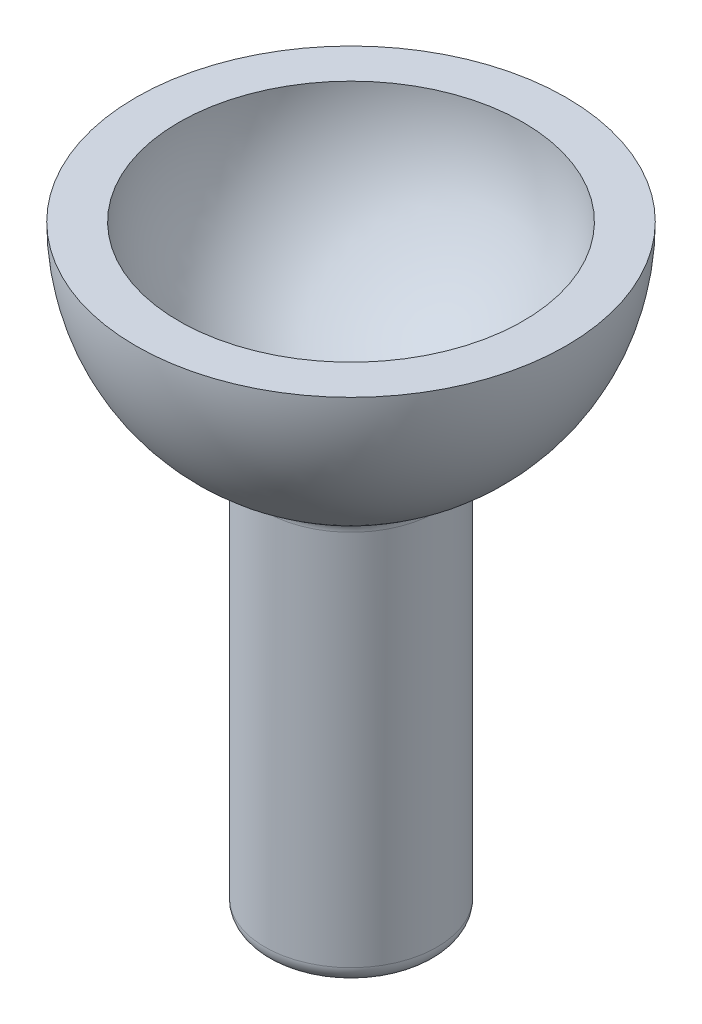
ISO-10303-21;
HEADER;
FILE_DESCRIPTION(('STEP AP214'),'2;1');
FILE_NAME('part.step','',(''),(''),'','','');
FILE_SCHEMA(('AUTOMOTIVE_DESIGN { 1 0 10303 214 1 1 1 1 }'));
ENDSEC;
DATA;
#1=APPLICATION_CONTEXT('core data for automotive mechanical design processes');
#2=APPLICATION_PROTOCOL_DEFINITION('international standard','automotive_design',2000,#1);
#3=PRODUCT_CONTEXT('',#1,'mechanical');
#4=PRODUCT('Part','Part','',(#3));
#5=PRODUCT_RELATED_PRODUCT_CATEGORY('part','',(#4));
#6=PRODUCT_DEFINITION_FORMATION('','',#4);
#7=PRODUCT_DEFINITION_CONTEXT('part definition',#1,'design');
#8=PRODUCT_DEFINITION('design','',#6,#7);
#9=PRODUCT_DEFINITION_SHAPE('','',#8);
#10=(LENGTH_UNIT() NAMED_UNIT(*) SI_UNIT(.MILLI.,.METRE.));
#11=(NAMED_UNIT(*) PLANE_ANGLE_UNIT() SI_UNIT($,.RADIAN.));
#12=(NAMED_UNIT(*) SI_UNIT($,.STERADIAN.) SOLID_ANGLE_UNIT());
#13=UNCERTAINTY_MEASURE_WITH_UNIT(LENGTH_MEASURE(1.E-05),#10,'distance_accuracy_value','');
#14=(GEOMETRIC_REPRESENTATION_CONTEXT(3) GLOBAL_UNCERTAINTY_ASSIGNED_CONTEXT((#13)) GLOBAL_UNIT_ASSIGNED_CONTEXT((#10,
#11,#12)) REPRESENTATION_CONTEXT('',''));
#15=CARTESIAN_POINT('',(0.,0.,0.));
#16=DIRECTION('',(0.,0.,1.));
#17=DIRECTION('',(1.,0.,0.));
#18=AXIS2_PLACEMENT_3D('',#15,#16,#17);
#19=CARTESIAN_POINT('',(0.,0.,0.));
#20=DIRECTION('',(0.,-1.,0.));
#21=DIRECTION('',(1.,0.,0.));
#22=AXIS2_PLACEMENT_3D('',#19,#20,#21);
#23=SPHERICAL_SURFACE('',#22,12.5);
#24=CARTESIAN_POINT('',(0.,-11.1975802059702,0.));
#25=DIRECTION('',(0.,1.,0.));
#26=DIRECTION('',(0.,0.,1.));
#27=AXIS2_PLACEMENT_3D('',#24,#25,#26);
#28=CIRCLE('',#27,5.55555555555555);
#29=CARTESIAN_POINT('',(0.,-11.1975802059702,5.55555555555555));
#30=VERTEX_POINT('',#29);
#31=EDGE_CURVE('E46',#30,#30,#28,.T.);
#32=ORIENTED_EDGE('',*,*,#31,.T.);
#33=EDGE_LOOP('',(#32));
#34=FACE_BOUND('',#33,.T.);
#35=CARTESIAN_POINT('',(0.,0.,0.));
#36=DIRECTION('',(0.,-1.,0.));
#37=DIRECTION('',(0.,0.,-1.));
#38=AXIS2_PLACEMENT_3D('',#35,#36,#37);
#39=CIRCLE('',#38,12.5);
#40=CARTESIAN_POINT('',(0.,0.,-12.5));
#41=VERTEX_POINT('',#40);
#42=EDGE_CURVE('E59',#41,#41,#39,.T.);
#43=ORIENTED_EDGE('',*,*,#42,.T.);
#44=EDGE_LOOP('',(#43));
#45=FACE_BOUND('',#44,.T.);
#46=ADVANCED_FACE('F39',(#34,#45),#23,.T.);
#47=CARTESIAN_POINT('',(0.,0.,0.));
#48=DIRECTION('',(0.,-1.,0.));
#49=DIRECTION('',(0.,0.,-1.));
#50=AXIS2_PLACEMENT_3D('',#47,#48,#49);
#51=PLANE('',#50);
#52=ORIENTED_EDGE('',*,*,#42,.F.);
#53=EDGE_LOOP('',(#52));
#54=FACE_BOUND('',#53,.T.);
#55=CARTESIAN_POINT('',(0.,0.,0.));
#56=DIRECTION('',(0.,-1.,0.));
#57=DIRECTION('',(0.,0.,-1.));
#58=AXIS2_PLACEMENT_3D('',#55,#56,#57);
#59=CIRCLE('',#58,10.);
#60=CARTESIAN_POINT('',(0.,0.,-10.));
#61=VERTEX_POINT('',#60);
#62=EDGE_CURVE('E62',#61,#61,#59,.T.);
#63=ORIENTED_EDGE('',*,*,#62,.T.);
#64=EDGE_LOOP('',(#63));
#65=FACE_BOUND('',#64,.T.);
#66=ADVANCED_FACE('F66',(#54,#65),#51,.F.);
#67=CARTESIAN_POINT('',(0.,0.,0.));
#68=DIRECTION('',(0.,-1.,0.));
#69=DIRECTION('',(-1.,0.,0.));
#70=AXIS2_PLACEMENT_3D('',#67,#68,#69);
#71=SPHERICAL_SURFACE('',#70,10.);
#72=ORIENTED_EDGE('',*,*,#62,.F.);
#73=EDGE_LOOP('',(#72));
#74=FACE_BOUND('',#73,.T.);
#75=ADVANCED_FACE('F68',(#74),#71,.F.);
#76=CARTESIAN_POINT('',(0.,-35.,0.));
#77=DIRECTION('',(0.,-1.,0.));
#78=DIRECTION('',(0.,0.,-1.));
#79=AXIS2_PLACEMENT_3D('',#76,#77,#78);
#80=PLANE('',#79);
#81=CARTESIAN_POINT('',(0.,-35.,0.));
#82=DIRECTION('',(0.,-1.,0.));
#83=DIRECTION('',(0.,0.,-1.));
#84=AXIS2_PLACEMENT_3D('',#81,#82,#83);
#85=CIRCLE('',#84,4.);
#86=CARTESIAN_POINT('',(0.,-35.,-4.));
#87=VERTEX_POINT('',#86);
#88=EDGE_CURVE('E10',#87,#87,#85,.T.);
#89=ORIENTED_EDGE('',*,*,#88,.T.);
#90=EDGE_LOOP('',(#89));
#91=FACE_BOUND('',#90,.T.);
#92=ADVANCED_FACE('F70',(#91),#80,.T.);
#93=CARTESIAN_POINT('',(0.,-11.8769057703332,0.));
#94=DIRECTION('',(0.,-1.,0.));
#95=DIRECTION('',(0.,0.,-1.));
#96=AXIS2_PLACEMENT_3D('',#93,#94,#95);
#97=CYLINDRICAL_SURFACE('',#96,5.);
#98=CARTESIAN_POINT('',(0.,-12.0933866224478,0.));
#99=DIRECTION('',(0.,1.,0.));
#100=DIRECTION('',(0.,0.,1.));
#101=AXIS2_PLACEMENT_3D('',#98,#99,#100);
#102=CIRCLE('',#101,5.);
#103=CARTESIAN_POINT('',(0.,-12.0933866224478,5.));
#104=VERTEX_POINT('',#103);
#105=EDGE_CURVE('E50',#104,#104,#102,.F.);
#106=ORIENTED_EDGE('',*,*,#105,.T.);
#107=EDGE_LOOP('',(#106));
#108=FACE_BOUND('',#107,.T.);
#109=CARTESIAN_POINT('',(0.,-34.,0.));
#110=DIRECTION('',(0.,-1.,0.));
#111=DIRECTION('',(0.,0.,-1.));
#112=AXIS2_PLACEMENT_3D('',#109,#110,#111);
#113=CIRCLE('',#112,5.);
#114=CARTESIAN_POINT('',(0.,-34.,-5.));
#115=VERTEX_POINT('',#114);
#116=EDGE_CURVE('E54',#115,#115,#113,.F.);
#117=ORIENTED_EDGE('',*,*,#116,.T.);
#118=EDGE_LOOP('',(#117));
#119=FACE_BOUND('',#118,.T.);
#120=ADVANCED_FACE('F77',(#108,#119),#97,.T.);
#121=CARTESIAN_POINT('',(0.,-12.0933866224478,0.));
#122=DIRECTION('',(0.,1.,0.));
#123=DIRECTION('',(0.,0.,1.));
#124=AXIS2_PLACEMENT_3D('',#121,#122,#123);
#125=TOROIDAL_SURFACE('',#124,6.,1.);
#126=ORIENTED_EDGE('',*,*,#31,.F.);
#127=EDGE_LOOP('',(#126));
#128=FACE_BOUND('',#127,.T.);
#129=ORIENTED_EDGE('',*,*,#105,.F.);
#130=EDGE_LOOP('',(#129));
#131=FACE_BOUND('',#130,.T.);
#132=ADVANCED_FACE('F85',(#128,#131),#125,.F.);
#133=CARTESIAN_POINT('',(0.,-34.,0.));
#134=DIRECTION('',(0.,-1.,0.));
#135=DIRECTION('',(0.,0.,-1.));
#136=AXIS2_PLACEMENT_3D('',#133,#134,#135);
#137=TOROIDAL_SURFACE('',#136,4.,1.);
#138=ORIENTED_EDGE('',*,*,#116,.F.);
#139=EDGE_LOOP('',(#138));
#140=FACE_BOUND('',#139,.T.);
#141=ORIENTED_EDGE('',*,*,#88,.F.);
#142=EDGE_LOOP('',(#141));
#143=FACE_BOUND('',#142,.T.);
#144=ADVANCED_FACE('F41',(#140,#143),#137,.T.);
#145=CLOSED_SHELL('',(#46,#66,#75,#92,#120,#132,#144));
#146=MANIFOLD_SOLID_BREP('B2',#145);
#147=ADVANCED_BREP_SHAPE_REPRESENTATION('',(#18,#146),#14);
#148=SHAPE_DEFINITION_REPRESENTATION(#9,#147);
ENDSEC;
END-ISO-10303-21;
